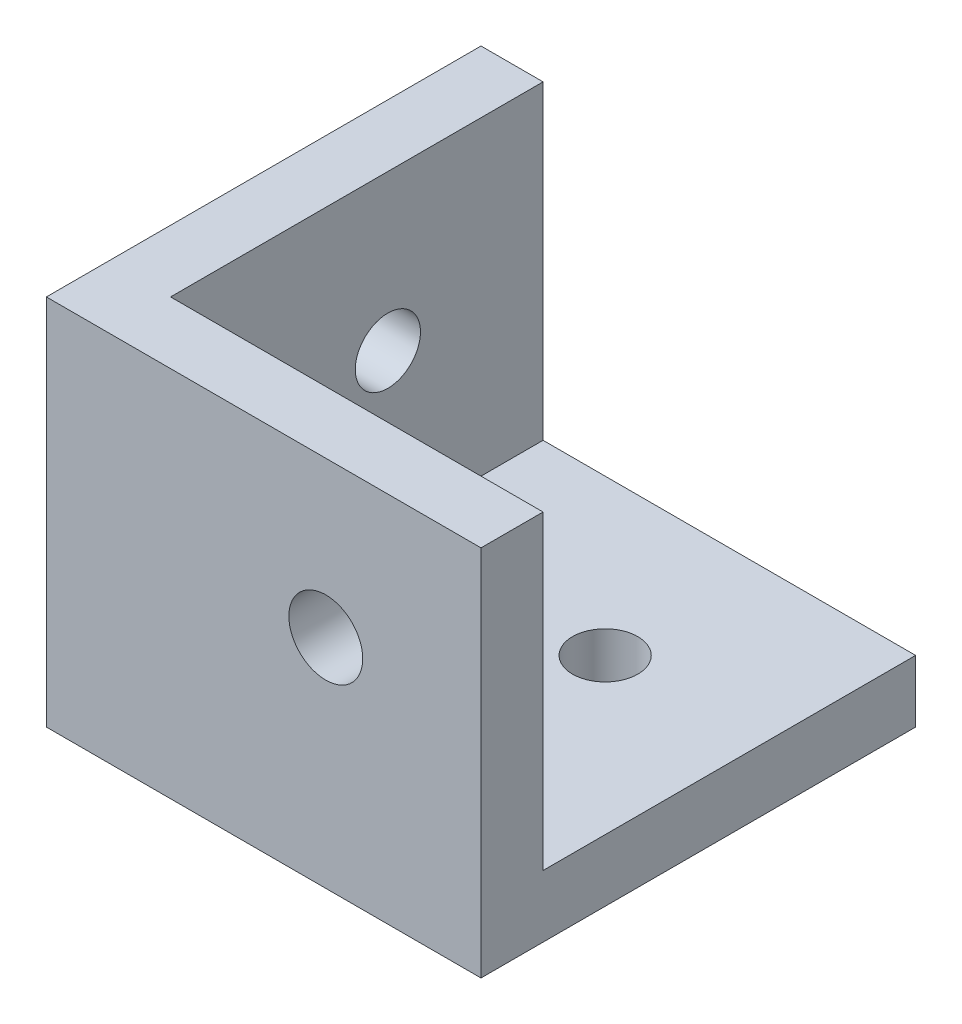
ISO-10303-21;
HEADER;
FILE_DESCRIPTION(('STEP AP214'),'2;1');
FILE_NAME('part.step','',(''),(''),'','','');
FILE_SCHEMA(('AUTOMOTIVE_DESIGN { 1 0 10303 214 1 1 1 1 }'));
ENDSEC;
DATA;
#1=APPLICATION_CONTEXT('core data for automotive mechanical design processes');
#2=APPLICATION_PROTOCOL_DEFINITION('international standard','automotive_design',2000,#1);
#3=PRODUCT_CONTEXT('',#1,'mechanical');
#4=PRODUCT('Part','Part','',(#3));
#5=PRODUCT_RELATED_PRODUCT_CATEGORY('part','',(#4));
#6=PRODUCT_DEFINITION_FORMATION('','',#4);
#7=PRODUCT_DEFINITION_CONTEXT('part definition',#1,'design');
#8=PRODUCT_DEFINITION('design','',#6,#7);
#9=PRODUCT_DEFINITION_SHAPE('','',#8);
#10=(LENGTH_UNIT() NAMED_UNIT(*) SI_UNIT(.MILLI.,.METRE.));
#11=(NAMED_UNIT(*) PLANE_ANGLE_UNIT() SI_UNIT($,.RADIAN.));
#12=(NAMED_UNIT(*) SI_UNIT($,.STERADIAN.) SOLID_ANGLE_UNIT());
#13=UNCERTAINTY_MEASURE_WITH_UNIT(LENGTH_MEASURE(1.E-05),#10,'distance_accuracy_value','');
#14=(GEOMETRIC_REPRESENTATION_CONTEXT(3) GLOBAL_UNCERTAINTY_ASSIGNED_CONTEXT((#13)) GLOBAL_UNIT_ASSIGNED_CONTEXT((#10,
#11,#12)) REPRESENTATION_CONTEXT('',''));
#15=CARTESIAN_POINT('',(0.,0.,0.));
#16=DIRECTION('',(0.,0.,1.));
#17=DIRECTION('',(1.,0.,0.));
#18=AXIS2_PLACEMENT_3D('',#15,#16,#17);
#19=CARTESIAN_POINT('',(12.,4.,0.));
#20=DIRECTION('',(1.,0.,0.));
#21=DIRECTION('',(0.,0.,-1.));
#22=AXIS2_PLACEMENT_3D('',#19,#20,#21);
#23=PLANE('',#22);
#24=DIRECTION('',(0.,0.,1.));
#25=VECTOR('',#24,1.);
#26=CARTESIAN_POINT('',(12.,0.,0.));
#27=LINE('',#26,#25);
#28=CARTESIAN_POINT('',(12.,0.,-12.));
#29=VERTEX_POINT('',#28);
#30=CARTESIAN_POINT('',(12.,0.,16.));
#31=VERTEX_POINT('',#30);
#32=EDGE_CURVE('E139',#29,#31,#27,.T.);
#33=ORIENTED_EDGE('',*,*,#32,.F.);
#34=DIRECTION('',(0.,-1.,0.));
#35=VECTOR('',#34,1.);
#36=CARTESIAN_POINT('',(12.,4.,-12.));
#37=LINE('',#36,#35);
#38=CARTESIAN_POINT('',(12.,4.,-12.));
#39=VERTEX_POINT('',#38);
#40=EDGE_CURVE('E11',#39,#29,#37,.T.);
#41=ORIENTED_EDGE('',*,*,#40,.F.);
#42=DIRECTION('',(0.,0.,1.));
#43=VECTOR('',#42,1.);
#44=CARTESIAN_POINT('',(12.,4.,0.));
#45=LINE('',#44,#43);
#46=CARTESIAN_POINT('',(12.,4.,12.));
#47=VERTEX_POINT('',#46);
#48=EDGE_CURVE('E149',#39,#47,#45,.T.);
#49=ORIENTED_EDGE('',*,*,#48,.T.);
#50=DIRECTION('',(0.,-1.,0.));
#51=VECTOR('',#50,1.);
#52=CARTESIAN_POINT('',(12.,24.,12.));
#53=LINE('',#52,#51);
#54=CARTESIAN_POINT('',(12.,24.,12.));
#55=VERTEX_POINT('',#54);
#56=EDGE_CURVE('E205',#55,#47,#53,.T.);
#57=ORIENTED_EDGE('',*,*,#56,.F.);
#58=DIRECTION('',(0.,0.,1.));
#59=VECTOR('',#58,1.);
#60=CARTESIAN_POINT('',(12.,24.,0.));
#61=LINE('',#60,#59);
#62=CARTESIAN_POINT('',(12.,24.,16.));
#63=VERTEX_POINT('',#62);
#64=EDGE_CURVE('E185',#55,#63,#61,.T.);
#65=ORIENTED_EDGE('',*,*,#64,.T.);
#66=DIRECTION('',(0.,-1.,0.));
#67=VECTOR('',#66,1.);
#68=CARTESIAN_POINT('',(12.,24.,16.));
#69=LINE('',#68,#67);
#70=EDGE_CURVE('E141',#63,#31,#69,.T.);
#71=ORIENTED_EDGE('',*,*,#70,.T.);
#72=EDGE_LOOP('',(#33,#41,#49,#57,#65,#71));
#73=FACE_BOUND('',#72,.T.);
#74=ADVANCED_FACE('F47',(#73),#23,.T.);
#75=CARTESIAN_POINT('',(0.,4.,-12.));
#76=DIRECTION('',(0.,0.,-1.));
#77=DIRECTION('',(-1.,0.,0.));
#78=AXIS2_PLACEMENT_3D('',#75,#76,#77);
#79=PLANE('',#78);
#80=DIRECTION('',(1.,0.,0.));
#81=VECTOR('',#80,1.);
#82=CARTESIAN_POINT('',(0.,0.,-12.));
#83=LINE('',#82,#81);
#84=CARTESIAN_POINT('',(-16.,0.,-12.));
#85=VERTEX_POINT('',#84);
#86=EDGE_CURVE('E131',#85,#29,#83,.T.);
#87=ORIENTED_EDGE('',*,*,#86,.F.);
#88=DIRECTION('',(0.,-1.,0.));
#89=VECTOR('',#88,1.);
#90=CARTESIAN_POINT('',(-16.,24.,-12.));
#91=LINE('',#90,#89);
#92=CARTESIAN_POINT('',(-16.,24.,-12.));
#93=VERTEX_POINT('',#92);
#94=EDGE_CURVE('E109',#93,#85,#91,.T.);
#95=ORIENTED_EDGE('',*,*,#94,.F.);
#96=DIRECTION('',(-1.,0.,0.));
#97=VECTOR('',#96,1.);
#98=CARTESIAN_POINT('',(0.,24.,-12.));
#99=LINE('',#98,#97);
#100=CARTESIAN_POINT('',(-12.,24.,-12.));
#101=VERTEX_POINT('',#100);
#102=EDGE_CURVE('E116',#101,#93,#99,.T.);
#103=ORIENTED_EDGE('',*,*,#102,.F.);
#104=DIRECTION('',(0.,-1.,0.));
#105=VECTOR('',#104,1.);
#106=CARTESIAN_POINT('',(-12.,24.,-12.));
#107=LINE('',#106,#105);
#108=CARTESIAN_POINT('',(-12.,4.,-12.));
#109=VERTEX_POINT('',#108);
#110=EDGE_CURVE('E194',#101,#109,#107,.T.);
#111=ORIENTED_EDGE('',*,*,#110,.T.);
#112=DIRECTION('',(1.,0.,0.));
#113=VECTOR('',#112,1.);
#114=CARTESIAN_POINT('',(0.,4.,-12.));
#115=LINE('',#114,#113);
#116=EDGE_CURVE('E152',#109,#39,#115,.T.);
#117=ORIENTED_EDGE('',*,*,#116,.T.);
#118=ORIENTED_EDGE('',*,*,#40,.T.);
#119=EDGE_LOOP('',(#87,#95,#103,#111,#117,#118));
#120=FACE_BOUND('',#119,.T.);
#121=ADVANCED_FACE('F129',(#120),#79,.T.);
#122=CARTESIAN_POINT('',(2.,4.,-2.));
#123=DIRECTION('',(0.,-1.,0.));
#124=DIRECTION('',(0.,0.,-1.));
#125=AXIS2_PLACEMENT_3D('',#122,#123,#124);
#126=CYLINDRICAL_SURFACE('',#125,2.1);
#127=CARTESIAN_POINT('',(2.,4.,-2.));
#128=DIRECTION('',(0.,1.,0.));
#129=DIRECTION('',(0.,0.,1.));
#130=AXIS2_PLACEMENT_3D('',#127,#128,#129);
#131=CIRCLE('',#130,2.1);
#132=CARTESIAN_POINT('',(2.,4.,0.0999999999999994));
#133=VERTEX_POINT('',#132);
#134=EDGE_CURVE('E145',#133,#133,#131,.T.);
#135=ORIENTED_EDGE('',*,*,#134,.T.);
#136=EDGE_LOOP('',(#135));
#137=FACE_BOUND('',#136,.T.);
#138=CARTESIAN_POINT('',(2.,0.,-2.));
#139=DIRECTION('',(0.,1.,0.));
#140=DIRECTION('',(0.,0.,1.));
#141=AXIS2_PLACEMENT_3D('',#138,#139,#140);
#142=CIRCLE('',#141,2.1);
#143=CARTESIAN_POINT('',(2.,0.,0.0999999999999994));
#144=VERTEX_POINT('',#143);
#145=EDGE_CURVE('E134',#144,#144,#142,.T.);
#146=ORIENTED_EDGE('',*,*,#145,.F.);
#147=EDGE_LOOP('',(#146));
#148=FACE_BOUND('',#147,.T.);
#149=ADVANCED_FACE('F49',(#137,#148),#126,.F.);
#150=CARTESIAN_POINT('',(0.,4.,0.));
#151=DIRECTION('',(0.,1.,0.));
#152=DIRECTION('',(0.,0.,1.));
#153=AXIS2_PLACEMENT_3D('',#150,#151,#152);
#154=PLANE('',#153);
#155=ORIENTED_EDGE('',*,*,#134,.F.);
#156=EDGE_LOOP('',(#155));
#157=FACE_BOUND('',#156,.T.);
#158=ORIENTED_EDGE('',*,*,#48,.F.);
#159=ORIENTED_EDGE('',*,*,#116,.F.);
#160=DIRECTION('',(0.,0.,1.));
#161=VECTOR('',#160,1.);
#162=CARTESIAN_POINT('',(-12.,4.,0.));
#163=LINE('',#162,#161);
#164=CARTESIAN_POINT('',(-12.,4.,12.));
#165=VERTEX_POINT('',#164);
#166=EDGE_CURVE('E156',#109,#165,#163,.T.);
#167=ORIENTED_EDGE('',*,*,#166,.T.);
#168=DIRECTION('',(1.,0.,0.));
#169=VECTOR('',#168,1.);
#170=CARTESIAN_POINT('',(0.,4.,12.));
#171=LINE('',#170,#169);
#172=EDGE_CURVE('E58',#165,#47,#171,.T.);
#173=ORIENTED_EDGE('',*,*,#172,.T.);
#174=EDGE_LOOP('',(#158,#159,#167,#173));
#175=FACE_BOUND('',#174,.T.);
#176=ADVANCED_FACE('F219',(#157,#175),#154,.T.);
#177=CARTESIAN_POINT('',(0.,0.,0.));
#178=DIRECTION('',(0.,1.,0.));
#179=DIRECTION('',(0.,0.,1.));
#180=AXIS2_PLACEMENT_3D('',#177,#178,#179);
#181=PLANE('',#180);
#182=ORIENTED_EDGE('',*,*,#32,.T.);
#183=DIRECTION('',(-1.,0.,0.));
#184=VECTOR('',#183,1.);
#185=CARTESIAN_POINT('',(0.,0.,16.));
#186=LINE('',#185,#184);
#187=CARTESIAN_POINT('',(-16.,0.,16.));
#188=VERTEX_POINT('',#187);
#189=EDGE_CURVE('E127',#31,#188,#186,.T.);
#190=ORIENTED_EDGE('',*,*,#189,.T.);
#191=DIRECTION('',(0.,0.,1.));
#192=VECTOR('',#191,1.);
#193=CARTESIAN_POINT('',(-16.,0.,0.));
#194=LINE('',#193,#192);
#195=EDGE_CURVE('E167',#85,#188,#194,.T.);
#196=ORIENTED_EDGE('',*,*,#195,.F.);
#197=ORIENTED_EDGE('',*,*,#86,.T.);
#198=EDGE_LOOP('',(#182,#190,#196,#197));
#199=FACE_BOUND('',#198,.T.);
#200=ORIENTED_EDGE('',*,*,#145,.T.);
#201=EDGE_LOOP('',(#200));
#202=FACE_BOUND('',#201,.T.);
#203=ADVANCED_FACE('F217',(#199,#202),#181,.F.);
#204=CARTESIAN_POINT('',(-16.,24.,0.));
#205=DIRECTION('',(1.,0.,0.));
#206=DIRECTION('',(0.,0.,-1.));
#207=AXIS2_PLACEMENT_3D('',#204,#205,#206);
#208=PLANE('',#207);
#209=CARTESIAN_POINT('',(-16.,14.,-2.));
#210=DIRECTION('',(-1.,0.,0.));
#211=DIRECTION('',(0.,0.,1.));
#212=AXIS2_PLACEMENT_3D('',#209,#210,#211);
#213=CIRCLE('',#212,2.1);
#214=CARTESIAN_POINT('',(-16.,14.,0.100000000000005));
#215=VERTEX_POINT('',#214);
#216=EDGE_CURVE('E180',#215,#215,#213,.T.);
#217=ORIENTED_EDGE('',*,*,#216,.F.);
#218=EDGE_LOOP('',(#217));
#219=FACE_BOUND('',#218,.T.);
#220=ORIENTED_EDGE('',*,*,#195,.T.);
#221=DIRECTION('',(0.,-1.,0.));
#222=VECTOR('',#221,1.);
#223=CARTESIAN_POINT('',(-16.,24.,16.));
#224=LINE('',#223,#222);
#225=CARTESIAN_POINT('',(-16.,24.,16.));
#226=VERTEX_POINT('',#225);
#227=EDGE_CURVE('E110',#226,#188,#224,.T.);
#228=ORIENTED_EDGE('',*,*,#227,.F.);
#229=DIRECTION('',(0.,0.,1.));
#230=VECTOR('',#229,1.);
#231=CARTESIAN_POINT('',(-16.,24.,0.));
#232=LINE('',#231,#230);
#233=EDGE_CURVE('E104',#93,#226,#232,.T.);
#234=ORIENTED_EDGE('',*,*,#233,.F.);
#235=ORIENTED_EDGE('',*,*,#94,.T.);
#236=EDGE_LOOP('',(#220,#228,#234,#235));
#237=FACE_BOUND('',#236,.T.);
#238=ADVANCED_FACE('F107',(#219,#237),#208,.F.);
#239=CARTESIAN_POINT('',(0.,24.,16.));
#240=DIRECTION('',(0.,0.,1.));
#241=DIRECTION('',(1.,0.,0.));
#242=AXIS2_PLACEMENT_3D('',#239,#240,#241);
#243=PLANE('',#242);
#244=CARTESIAN_POINT('',(2.,14.,16.));
#245=DIRECTION('',(0.,0.,1.));
#246=DIRECTION('',(1.,0.,0.));
#247=AXIS2_PLACEMENT_3D('',#244,#245,#246);
#248=CIRCLE('',#247,2.37993699844788);
#249=CARTESIAN_POINT('',(4.37993699844788,14.,16.));
#250=VERTEX_POINT('',#249);
#251=EDGE_CURVE('E168',#250,#250,#248,.T.);
#252=ORIENTED_EDGE('',*,*,#251,.F.);
#253=EDGE_LOOP('',(#252));
#254=FACE_BOUND('',#253,.T.);
#255=ORIENTED_EDGE('',*,*,#189,.F.);
#256=ORIENTED_EDGE('',*,*,#70,.F.);
#257=DIRECTION('',(-1.,0.,0.));
#258=VECTOR('',#257,1.);
#259=CARTESIAN_POINT('',(0.,24.,16.));
#260=LINE('',#259,#258);
#261=EDGE_CURVE('E115',#63,#226,#260,.T.);
#262=ORIENTED_EDGE('',*,*,#261,.T.);
#263=ORIENTED_EDGE('',*,*,#227,.T.);
#264=EDGE_LOOP('',(#255,#256,#262,#263));
#265=FACE_BOUND('',#264,.T.);
#266=ADVANCED_FACE('F215',(#254,#265),#243,.T.);
#267=CARTESIAN_POINT('',(0.,24.,12.));
#268=DIRECTION('',(0.,0.,-1.));
#269=DIRECTION('',(-1.,0.,0.));
#270=AXIS2_PLACEMENT_3D('',#267,#268,#269);
#271=PLANE('',#270);
#272=CARTESIAN_POINT('',(2.,14.,12.));
#273=DIRECTION('',(0.,0.,-1.));
#274=DIRECTION('',(-1.,0.,0.));
#275=AXIS2_PLACEMENT_3D('',#272,#273,#274);
#276=CIRCLE('',#275,2.37993699844788);
#277=CARTESIAN_POINT('',(-0.379936998447877,14.,12.));
#278=VERTEX_POINT('',#277);
#279=EDGE_CURVE('E164',#278,#278,#276,.T.);
#280=ORIENTED_EDGE('',*,*,#279,.F.);
#281=EDGE_LOOP('',(#280));
#282=FACE_BOUND('',#281,.T.);
#283=ORIENTED_EDGE('',*,*,#56,.T.);
#284=ORIENTED_EDGE('',*,*,#172,.F.);
#285=DIRECTION('',(0.,-1.,0.));
#286=VECTOR('',#285,1.);
#287=CARTESIAN_POINT('',(-12.,24.,12.));
#288=LINE('',#287,#286);
#289=CARTESIAN_POINT('',(-12.,24.,12.));
#290=VERTEX_POINT('',#289);
#291=EDGE_CURVE('E201',#290,#165,#288,.T.);
#292=ORIENTED_EDGE('',*,*,#291,.F.);
#293=DIRECTION('',(1.,0.,0.));
#294=VECTOR('',#293,1.);
#295=CARTESIAN_POINT('',(0.,24.,12.));
#296=LINE('',#295,#294);
#297=EDGE_CURVE('E189',#290,#55,#296,.T.);
#298=ORIENTED_EDGE('',*,*,#297,.T.);
#299=EDGE_LOOP('',(#283,#284,#292,#298));
#300=FACE_BOUND('',#299,.T.);
#301=ADVANCED_FACE('F224',(#282,#300),#271,.T.);
#302=CARTESIAN_POINT('',(-12.,24.,0.));
#303=DIRECTION('',(1.,0.,0.));
#304=DIRECTION('',(0.,0.,-1.));
#305=AXIS2_PLACEMENT_3D('',#302,#303,#304);
#306=PLANE('',#305);
#307=CARTESIAN_POINT('',(-12.,14.,-2.));
#308=DIRECTION('',(1.,0.,0.));
#309=DIRECTION('',(0.,0.,-1.));
#310=AXIS2_PLACEMENT_3D('',#307,#308,#309);
#311=CIRCLE('',#310,2.1);
#312=CARTESIAN_POINT('',(-12.,14.,-4.1));
#313=VERTEX_POINT('',#312);
#314=EDGE_CURVE('E51',#313,#313,#311,.T.);
#315=ORIENTED_EDGE('',*,*,#314,.F.);
#316=EDGE_LOOP('',(#315));
#317=FACE_BOUND('',#316,.T.);
#318=ORIENTED_EDGE('',*,*,#291,.T.);
#319=ORIENTED_EDGE('',*,*,#166,.F.);
#320=ORIENTED_EDGE('',*,*,#110,.F.);
#321=DIRECTION('',(0.,0.,1.));
#322=VECTOR('',#321,1.);
#323=CARTESIAN_POINT('',(-12.,24.,0.));
#324=LINE('',#323,#322);
#325=EDGE_CURVE('E123',#101,#290,#324,.T.);
#326=ORIENTED_EDGE('',*,*,#325,.T.);
#327=EDGE_LOOP('',(#318,#319,#320,#326));
#328=FACE_BOUND('',#327,.T.);
#329=ADVANCED_FACE('F222',(#317,#328),#306,.T.);
#330=CARTESIAN_POINT('',(0.,24.,0.));
#331=DIRECTION('',(0.,1.,0.));
#332=DIRECTION('',(0.,0.,1.));
#333=AXIS2_PLACEMENT_3D('',#330,#331,#332);
#334=PLANE('',#333);
#335=ORIENTED_EDGE('',*,*,#102,.T.);
#336=ORIENTED_EDGE('',*,*,#233,.T.);
#337=ORIENTED_EDGE('',*,*,#261,.F.);
#338=ORIENTED_EDGE('',*,*,#64,.F.);
#339=ORIENTED_EDGE('',*,*,#297,.F.);
#340=ORIENTED_EDGE('',*,*,#325,.F.);
#341=EDGE_LOOP('',(#335,#336,#337,#338,#339,#340));
#342=FACE_BOUND('',#341,.T.);
#343=ADVANCED_FACE('F120',(#342),#334,.T.);
#344=CARTESIAN_POINT('',(2.,14.,-12.));
#345=DIRECTION('',(0.,0.,1.));
#346=DIRECTION('',(1.,0.,0.));
#347=AXIS2_PLACEMENT_3D('',#344,#345,#346);
#348=CYLINDRICAL_SURFACE('',#347,2.37993699844788);
#349=ORIENTED_EDGE('',*,*,#279,.T.);
#350=EDGE_LOOP('',(#349));
#351=FACE_BOUND('',#350,.T.);
#352=ORIENTED_EDGE('',*,*,#251,.T.);
#353=EDGE_LOOP('',(#352));
#354=FACE_BOUND('',#353,.T.);
#355=ADVANCED_FACE('F259',(#351,#354),#348,.F.);
#356=CARTESIAN_POINT('',(12.,14.,-2.));
#357=DIRECTION('',(-1.,0.,0.));
#358=DIRECTION('',(0.,0.,1.));
#359=AXIS2_PLACEMENT_3D('',#356,#357,#358);
#360=CYLINDRICAL_SURFACE('',#359,2.1);
#361=ORIENTED_EDGE('',*,*,#314,.T.);
#362=EDGE_LOOP('',(#361));
#363=FACE_BOUND('',#362,.T.);
#364=ORIENTED_EDGE('',*,*,#216,.T.);
#365=EDGE_LOOP('',(#364));
#366=FACE_BOUND('',#365,.T.);
#367=ADVANCED_FACE('F257',(#363,#366),#360,.F.);
#368=CLOSED_SHELL('',(#74,#121,#149,#176,#203,#238,#266,#301,#329,#343,#355,#367));
#369=MANIFOLD_SOLID_BREP('B2',#368);
#370=ADVANCED_BREP_SHAPE_REPRESENTATION('',(#18,#369),#14);
#371=SHAPE_DEFINITION_REPRESENTATION(#9,#370);
ENDSEC;
END-ISO-10303-21;
